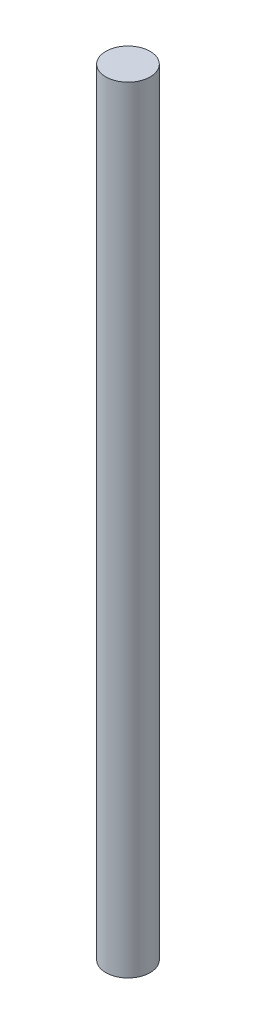
ISO-10303-21;
HEADER;
FILE_DESCRIPTION(('STEP AP214'),'2;1');
FILE_NAME('part.step','',(''),(''),'','','');
FILE_SCHEMA(('AUTOMOTIVE_DESIGN { 1 0 10303 214 1 1 1 1 }'));
ENDSEC;
DATA;
#1=APPLICATION_CONTEXT('core data for automotive mechanical design processes');
#2=APPLICATION_PROTOCOL_DEFINITION('international standard','automotive_design',2000,#1);
#3=PRODUCT_CONTEXT('',#1,'mechanical');
#4=PRODUCT('Part','Part','',(#3));
#5=PRODUCT_RELATED_PRODUCT_CATEGORY('part','',(#4));
#6=PRODUCT_DEFINITION_FORMATION('','',#4);
#7=PRODUCT_DEFINITION_CONTEXT('part definition',#1,'design');
#8=PRODUCT_DEFINITION('design','',#6,#7);
#9=PRODUCT_DEFINITION_SHAPE('','',#8);
#10=(LENGTH_UNIT() NAMED_UNIT(*) SI_UNIT(.MILLI.,.METRE.));
#11=(NAMED_UNIT(*) PLANE_ANGLE_UNIT() SI_UNIT($,.RADIAN.));
#12=(NAMED_UNIT(*) SI_UNIT($,.STERADIAN.) SOLID_ANGLE_UNIT());
#13=UNCERTAINTY_MEASURE_WITH_UNIT(LENGTH_MEASURE(1.E-05),#10,'distance_accuracy_value','');
#14=(GEOMETRIC_REPRESENTATION_CONTEXT(3) GLOBAL_UNCERTAINTY_ASSIGNED_CONTEXT((#13)) GLOBAL_UNIT_ASSIGNED_CONTEXT((#10,
#11,#12)) REPRESENTATION_CONTEXT('',''));
#15=CARTESIAN_POINT('',(0.,0.,0.));
#16=DIRECTION('',(0.,0.,1.));
#17=DIRECTION('',(1.,0.,0.));
#18=AXIS2_PLACEMENT_3D('',#15,#16,#17);
#19=CARTESIAN_POINT('',(0.,140.,0.));
#20=DIRECTION('',(0.,-1.,0.));
#21=DIRECTION('',(0.,0.,-1.));
#22=AXIS2_PLACEMENT_3D('',#19,#20,#21);
#23=CYLINDRICAL_SURFACE('',#22,4.);
#24=CARTESIAN_POINT('',(0.,140.,0.));
#25=DIRECTION('',(0.,1.,0.));
#26=DIRECTION('',(0.,0.,1.));
#27=AXIS2_PLACEMENT_3D('',#24,#25,#26);
#28=CIRCLE('',#27,4.);
#29=CARTESIAN_POINT('',(0.,140.,4.));
#30=VERTEX_POINT('',#29);
#31=EDGE_CURVE('E10',#30,#30,#28,.T.);
#32=ORIENTED_EDGE('',*,*,#31,.F.);
#33=EDGE_LOOP('',(#32));
#34=FACE_BOUND('',#33,.T.);
#35=CARTESIAN_POINT('',(0.,0.,0.));
#36=DIRECTION('',(0.,1.,0.));
#37=DIRECTION('',(0.,0.,1.));
#38=AXIS2_PLACEMENT_3D('',#35,#36,#37);
#39=CIRCLE('',#38,4.);
#40=CARTESIAN_POINT('',(0.,0.,4.));
#41=VERTEX_POINT('',#40);
#42=EDGE_CURVE('E46',#41,#41,#39,.T.);
#43=ORIENTED_EDGE('',*,*,#42,.T.);
#44=EDGE_LOOP('',(#43));
#45=FACE_BOUND('',#44,.T.);
#46=ADVANCED_FACE('F43',(#34,#45),#23,.T.);
#47=CARTESIAN_POINT('',(0.,140.,0.));
#48=DIRECTION('',(0.,1.,0.));
#49=DIRECTION('',(0.,0.,1.));
#50=AXIS2_PLACEMENT_3D('',#47,#48,#49);
#51=PLANE('',#50);
#52=ORIENTED_EDGE('',*,*,#31,.T.);
#53=EDGE_LOOP('',(#52));
#54=FACE_BOUND('',#53,.T.);
#55=ADVANCED_FACE('F60',(#54),#51,.T.);
#56=CARTESIAN_POINT('',(0.,0.,0.));
#57=DIRECTION('',(0.,1.,0.));
#58=DIRECTION('',(0.,0.,1.));
#59=AXIS2_PLACEMENT_3D('',#56,#57,#58);
#60=PLANE('',#59);
#61=ORIENTED_EDGE('',*,*,#42,.F.);
#62=EDGE_LOOP('',(#61));
#63=FACE_BOUND('',#62,.T.);
#64=ADVANCED_FACE('F58',(#63),#60,.F.);
#65=CLOSED_SHELL('',(#46,#55,#64));
#66=MANIFOLD_SOLID_BREP('B2',#65);
#67=ADVANCED_BREP_SHAPE_REPRESENTATION('',(#18,#66),#14);
#68=SHAPE_DEFINITION_REPRESENTATION(#9,#67);
ENDSEC;
END-ISO-10303-21;
